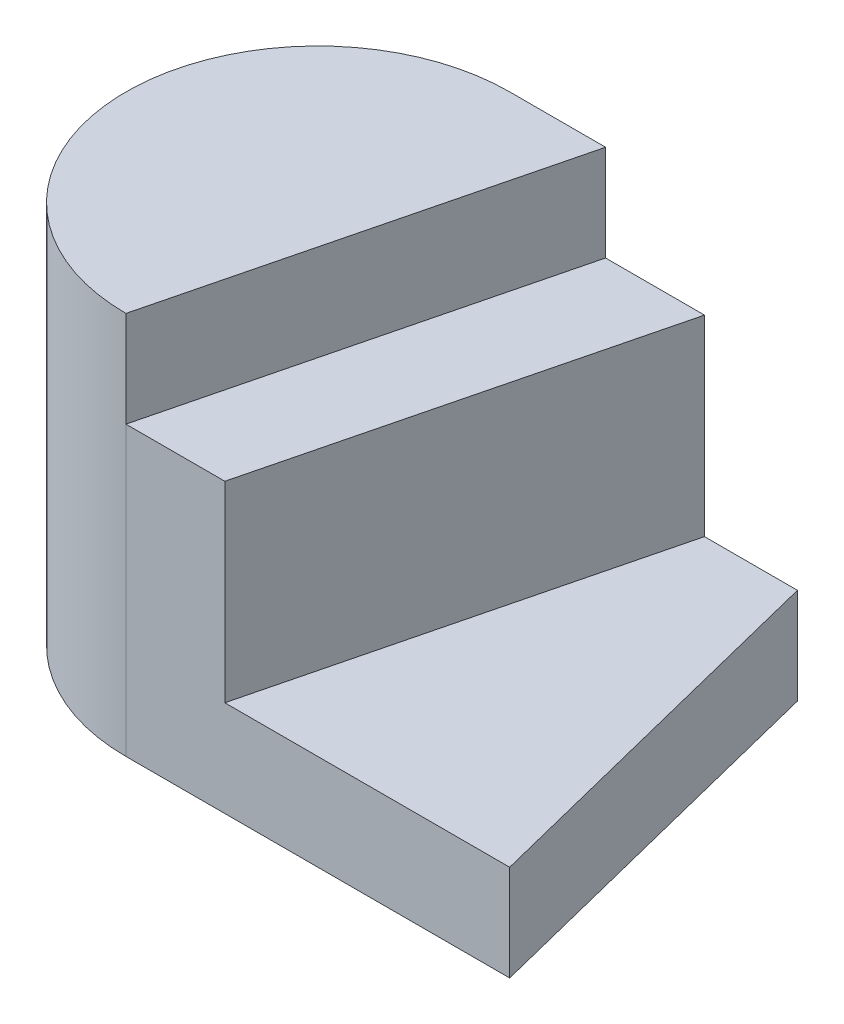
ISO-10303-21;
HEADER;
FILE_DESCRIPTION(('STEP AP214'),'2;1');
FILE_NAME('part.step','',(''),(''),'','','');
FILE_SCHEMA(('AUTOMOTIVE_DESIGN { 1 0 10303 214 1 1 1 1 }'));
ENDSEC;
DATA;
#1=APPLICATION_CONTEXT('core data for automotive mechanical design processes');
#2=APPLICATION_PROTOCOL_DEFINITION('international standard','automotive_design',2000,#1);
#3=PRODUCT_CONTEXT('',#1,'mechanical');
#4=PRODUCT('Part','Part','',(#3));
#5=PRODUCT_RELATED_PRODUCT_CATEGORY('part','',(#4));
#6=PRODUCT_DEFINITION_FORMATION('','',#4);
#7=PRODUCT_DEFINITION_CONTEXT('part definition',#1,'design');
#8=PRODUCT_DEFINITION('design','',#6,#7);
#9=PRODUCT_DEFINITION_SHAPE('','',#8);
#10=(LENGTH_UNIT() NAMED_UNIT(*) SI_UNIT(.MILLI.,.METRE.));
#11=(NAMED_UNIT(*) PLANE_ANGLE_UNIT() SI_UNIT($,.RADIAN.));
#12=(NAMED_UNIT(*) SI_UNIT($,.STERADIAN.) SOLID_ANGLE_UNIT());
#13=UNCERTAINTY_MEASURE_WITH_UNIT(LENGTH_MEASURE(1.E-05),#10,'distance_accuracy_value','');
#14=(GEOMETRIC_REPRESENTATION_CONTEXT(3) GLOBAL_UNCERTAINTY_ASSIGNED_CONTEXT((#13)) GLOBAL_UNIT_ASSIGNED_CONTEXT((#10,
#11,#12)) REPRESENTATION_CONTEXT('',''));
#15=CARTESIAN_POINT('',(0.,0.,0.));
#16=DIRECTION('',(0.,0.,1.));
#17=DIRECTION('',(1.,0.,0.));
#18=AXIS2_PLACEMENT_3D('',#15,#16,#17);
#19=CARTESIAN_POINT('',(0.,0.,0.));
#20=DIRECTION('',(0.,1.,0.));
#21=DIRECTION('',(0.,0.,1.));
#22=AXIS2_PLACEMENT_3D('',#19,#20,#21);
#23=PLANE('',#22);
#24=DIRECTION('',(-0.242535625036333,0.,0.970142500145332));
#25=VECTOR('',#24,1.);
#26=CARTESIAN_POINT('',(14.4073073543945,0.,3.60182683859862));
#27=LINE('',#26,#25);
#28=CARTESIAN_POINT('',(20.3077640640442,0.,-20.));
#29=VERTEX_POINT('',#28);
#30=CARTESIAN_POINT('',(10.3077640640442,0.,20.));
#31=VERTEX_POINT('',#30);
#32=EDGE_CURVE('E55',#29,#31,#27,.T.);
#33=ORIENTED_EDGE('',*,*,#32,.T.);
#34=DIRECTION('',(1.,0.,0.));
#35=VECTOR('',#34,1.);
#36=CARTESIAN_POINT('',(0.,0.,20.));
#37=LINE('',#36,#35);
#38=CARTESIAN_POINT('',(40.,0.,20.));
#39=VERTEX_POINT('',#38);
#40=EDGE_CURVE('E136',#31,#39,#37,.T.);
#41=ORIENTED_EDGE('',*,*,#40,.T.);
#42=DIRECTION('',(-0.242535625036333,0.,-0.970142500145332));
#43=VECTOR('',#42,1.);
#44=CARTESIAN_POINT('',(40.,0.,20.));
#45=LINE('',#44,#43);
#46=CARTESIAN_POINT('',(30.,0.,-20.));
#47=VERTEX_POINT('',#46);
#48=EDGE_CURVE('E150',#39,#47,#45,.T.);
#49=ORIENTED_EDGE('',*,*,#48,.T.);
#50=DIRECTION('',(-1.,0.,0.));
#51=VECTOR('',#50,1.);
#52=CARTESIAN_POINT('',(30.,0.,-20.));
#53=LINE('',#52,#51);
#54=EDGE_CURVE('E50',#47,#29,#53,.T.);
#55=ORIENTED_EDGE('',*,*,#54,.T.);
#56=EDGE_LOOP('',(#33,#41,#49,#55));
#57=FACE_BOUND('',#56,.T.);
#58=ADVANCED_FACE('F33',(#57),#23,.T.);
#59=CARTESIAN_POINT('',(0.,-10.,0.));
#60=DIRECTION('',(0.,1.,0.));
#61=DIRECTION('',(0.,0.,1.));
#62=AXIS2_PLACEMENT_3D('',#59,#60,#61);
#63=CYLINDRICAL_SURFACE('',#62,20.);
#64=DIRECTION('',(0.,1.,0.));
#65=VECTOR('',#64,1.);
#66=CARTESIAN_POINT('',(0.,-10.,20.));
#67=LINE('',#66,#65);
#68=CARTESIAN_POINT('',(0.,-10.,20.));
#69=VERTEX_POINT('',#68);
#70=CARTESIAN_POINT('',(0.,20.,20.));
#71=VERTEX_POINT('',#70);
#72=EDGE_CURVE('E37',#69,#71,#67,.T.);
#73=ORIENTED_EDGE('',*,*,#72,.T.);
#74=DIRECTION('',(0.,-1.,0.));
#75=VECTOR('',#74,1.);
#76=CARTESIAN_POINT('',(0.,30.,20.));
#77=LINE('',#76,#75);
#78=CARTESIAN_POINT('',(0.,30.,20.));
#79=VERTEX_POINT('',#78);
#80=EDGE_CURVE('E132',#79,#71,#77,.T.);
#81=ORIENTED_EDGE('',*,*,#80,.F.);
#82=CARTESIAN_POINT('',(0.,30.,0.));
#83=DIRECTION('',(0.,1.,0.));
#84=DIRECTION('',(0.,0.,1.));
#85=AXIS2_PLACEMENT_3D('',#82,#83,#84);
#86=CIRCLE('',#85,20.);
#87=CARTESIAN_POINT('',(0.,30.,-20.));
#88=VERTEX_POINT('',#87);
#89=EDGE_CURVE('E130',#88,#79,#86,.T.);
#90=ORIENTED_EDGE('',*,*,#89,.F.);
#91=DIRECTION('',(0.,1.,0.));
#92=VECTOR('',#91,1.);
#93=CARTESIAN_POINT('',(0.,-10.,-20.));
#94=LINE('',#93,#92);
#95=CARTESIAN_POINT('',(0.,-10.,-20.));
#96=VERTEX_POINT('',#95);
#97=EDGE_CURVE('E11',#96,#88,#94,.T.);
#98=ORIENTED_EDGE('',*,*,#97,.F.);
#99=CARTESIAN_POINT('',(0.,-10.,0.));
#100=DIRECTION('',(0.,1.,0.));
#101=DIRECTION('',(0.,0.,1.));
#102=AXIS2_PLACEMENT_3D('',#99,#100,#101);
#103=CIRCLE('',#102,20.);
#104=EDGE_CURVE('E137',#96,#69,#103,.T.);
#105=ORIENTED_EDGE('',*,*,#104,.T.);
#106=EDGE_LOOP('',(#73,#81,#90,#98,#105));
#107=FACE_BOUND('',#106,.T.);
#108=ADVANCED_FACE('F35',(#107),#63,.T.);
#109=CARTESIAN_POINT('',(30.,-10.,-20.));
#110=DIRECTION('',(0.,0.,-1.));
#111=DIRECTION('',(-1.,0.,0.));
#112=AXIS2_PLACEMENT_3D('',#109,#110,#111);
#113=PLANE('',#112);
#114=ORIENTED_EDGE('',*,*,#54,.F.);
#115=DIRECTION('',(0.,1.,0.));
#116=VECTOR('',#115,1.);
#117=CARTESIAN_POINT('',(30.,-10.,-20.));
#118=LINE('',#117,#116);
#119=CARTESIAN_POINT('',(30.,-10.,-20.));
#120=VERTEX_POINT('',#119);
#121=EDGE_CURVE('E42',#120,#47,#118,.T.);
#122=ORIENTED_EDGE('',*,*,#121,.F.);
#123=DIRECTION('',(-1.,0.,0.));
#124=VECTOR('',#123,1.);
#125=CARTESIAN_POINT('',(30.,-10.,-20.));
#126=LINE('',#125,#124);
#127=EDGE_CURVE('E146',#120,#96,#126,.T.);
#128=ORIENTED_EDGE('',*,*,#127,.T.);
#129=ORIENTED_EDGE('',*,*,#97,.T.);
#130=DIRECTION('',(-1.,0.,0.));
#131=VECTOR('',#130,1.);
#132=CARTESIAN_POINT('',(0.,30.,-20.));
#133=LINE('',#132,#131);
#134=CARTESIAN_POINT('',(10.,30.,-20.));
#135=VERTEX_POINT('',#134);
#136=EDGE_CURVE('E127',#135,#88,#133,.T.);
#137=ORIENTED_EDGE('',*,*,#136,.F.);
#138=DIRECTION('',(0.,-1.,0.));
#139=VECTOR('',#138,1.);
#140=CARTESIAN_POINT('',(10.,30.,-20.));
#141=LINE('',#140,#139);
#142=CARTESIAN_POINT('',(10.,20.,-20.));
#143=VERTEX_POINT('',#142);
#144=EDGE_CURVE('E110',#135,#143,#141,.T.);
#145=ORIENTED_EDGE('',*,*,#144,.T.);
#146=DIRECTION('',(-1.,0.,0.));
#147=VECTOR('',#146,1.);
#148=CARTESIAN_POINT('',(0.,20.,-20.));
#149=LINE('',#148,#147);
#150=CARTESIAN_POINT('',(20.3077640640442,20.,-20.));
#151=VERTEX_POINT('',#150);
#152=EDGE_CURVE('E107',#151,#143,#149,.T.);
#153=ORIENTED_EDGE('',*,*,#152,.F.);
#154=DIRECTION('',(0.,-1.,0.));
#155=VECTOR('',#154,1.);
#156=CARTESIAN_POINT('',(20.3077640640442,20.,-20.));
#157=LINE('',#156,#155);
#158=EDGE_CURVE('E95',#151,#29,#157,.T.);
#159=ORIENTED_EDGE('',*,*,#158,.T.);
#160=EDGE_LOOP('',(#114,#122,#128,#129,#137,#145,#153,#159));
#161=FACE_BOUND('',#160,.T.);
#162=ADVANCED_FACE('F108',(#161),#113,.T.);
#163=CARTESIAN_POINT('',(40.,-10.,20.));
#164=DIRECTION('',(0.970142500145332,0.,-0.242535625036333));
#165=DIRECTION('',(-0.242535625036333,0.,-0.970142500145332));
#166=AXIS2_PLACEMENT_3D('',#163,#164,#165);
#167=PLANE('',#166);
#168=ORIENTED_EDGE('',*,*,#48,.F.);
#169=DIRECTION('',(0.,1.,0.));
#170=VECTOR('',#169,1.);
#171=CARTESIAN_POINT('',(40.,-10.,20.));
#172=LINE('',#171,#170);
#173=CARTESIAN_POINT('',(40.,-10.,20.));
#174=VERTEX_POINT('',#173);
#175=EDGE_CURVE('E153',#174,#39,#172,.T.);
#176=ORIENTED_EDGE('',*,*,#175,.F.);
#177=DIRECTION('',(-0.242535625036333,0.,-0.970142500145332));
#178=VECTOR('',#177,1.);
#179=CARTESIAN_POINT('',(40.,-10.,20.));
#180=LINE('',#179,#178);
#181=EDGE_CURVE('E143',#174,#120,#180,.T.);
#182=ORIENTED_EDGE('',*,*,#181,.T.);
#183=ORIENTED_EDGE('',*,*,#121,.T.);
#184=EDGE_LOOP('',(#168,#176,#182,#183));
#185=FACE_BOUND('',#184,.T.);
#186=ADVANCED_FACE('F169',(#185),#167,.T.);
#187=CARTESIAN_POINT('',(0.,-10.,20.));
#188=DIRECTION('',(0.,0.,1.));
#189=DIRECTION('',(1.,0.,0.));
#190=AXIS2_PLACEMENT_3D('',#187,#188,#189);
#191=PLANE('',#190);
#192=ORIENTED_EDGE('',*,*,#40,.F.);
#193=DIRECTION('',(0.,-1.,0.));
#194=VECTOR('',#193,1.);
#195=CARTESIAN_POINT('',(10.3077640640442,20.,20.));
#196=LINE('',#195,#194);
#197=CARTESIAN_POINT('',(10.3077640640442,20.,20.));
#198=VERTEX_POINT('',#197);
#199=EDGE_CURVE('E103',#198,#31,#196,.T.);
#200=ORIENTED_EDGE('',*,*,#199,.F.);
#201=DIRECTION('',(1.,0.,0.));
#202=VECTOR('',#201,1.);
#203=CARTESIAN_POINT('',(0.,20.,20.));
#204=LINE('',#203,#202);
#205=EDGE_CURVE('E117',#71,#198,#204,.T.);
#206=ORIENTED_EDGE('',*,*,#205,.F.);
#207=ORIENTED_EDGE('',*,*,#72,.F.);
#208=DIRECTION('',(1.,0.,0.));
#209=VECTOR('',#208,1.);
#210=CARTESIAN_POINT('',(0.,-10.,20.));
#211=LINE('',#210,#209);
#212=EDGE_CURVE('E140',#69,#174,#211,.T.);
#213=ORIENTED_EDGE('',*,*,#212,.T.);
#214=ORIENTED_EDGE('',*,*,#175,.T.);
#215=EDGE_LOOP('',(#192,#200,#206,#207,#213,#214));
#216=FACE_BOUND('',#215,.T.);
#217=ADVANCED_FACE('F165',(#216),#191,.T.);
#218=CARTESIAN_POINT('',(0.,-10.,0.));
#219=DIRECTION('',(0.,1.,0.));
#220=DIRECTION('',(0.,0.,1.));
#221=AXIS2_PLACEMENT_3D('',#218,#219,#220);
#222=PLANE('',#221);
#223=ORIENTED_EDGE('',*,*,#104,.F.);
#224=ORIENTED_EDGE('',*,*,#127,.F.);
#225=ORIENTED_EDGE('',*,*,#181,.F.);
#226=ORIENTED_EDGE('',*,*,#212,.F.);
#227=EDGE_LOOP('',(#223,#224,#225,#226));
#228=FACE_BOUND('',#227,.T.);
#229=ADVANCED_FACE('F171',(#228),#222,.F.);
#230=CARTESIAN_POINT('',(4.70588235294118,30.,1.17647058823529));
#231=DIRECTION('',(0.970142500145332,0.,0.242535625036333));
#232=DIRECTION('',(0.242535625036333,0.,-0.970142500145332));
#233=AXIS2_PLACEMENT_3D('',#230,#231,#232);
#234=PLANE('',#233);
#235=DIRECTION('',(-0.242535625036333,0.,0.970142500145332));
#236=VECTOR('',#235,1.);
#237=CARTESIAN_POINT('',(4.70588235294118,20.,1.17647058823529));
#238=LINE('',#237,#236);
#239=EDGE_CURVE('E113',#143,#71,#238,.T.);
#240=ORIENTED_EDGE('',*,*,#239,.F.);
#241=ORIENTED_EDGE('',*,*,#144,.F.);
#242=DIRECTION('',(-0.242535625036333,0.,0.970142500145332));
#243=VECTOR('',#242,1.);
#244=CARTESIAN_POINT('',(4.70588235294118,30.,1.17647058823529));
#245=LINE('',#244,#243);
#246=EDGE_CURVE('E102',#135,#79,#245,.T.);
#247=ORIENTED_EDGE('',*,*,#246,.T.);
#248=ORIENTED_EDGE('',*,*,#80,.T.);
#249=EDGE_LOOP('',(#240,#241,#247,#248));
#250=FACE_BOUND('',#249,.T.);
#251=ADVANCED_FACE('F163',(#250),#234,.T.);
#252=CARTESIAN_POINT('',(0.,30.,0.));
#253=DIRECTION('',(0.,1.,0.));
#254=DIRECTION('',(0.,0.,1.));
#255=AXIS2_PLACEMENT_3D('',#252,#253,#254);
#256=PLANE('',#255);
#257=ORIENTED_EDGE('',*,*,#246,.F.);
#258=ORIENTED_EDGE('',*,*,#136,.T.);
#259=ORIENTED_EDGE('',*,*,#89,.T.);
#260=EDGE_LOOP('',(#257,#258,#259));
#261=FACE_BOUND('',#260,.T.);
#262=ADVANCED_FACE('F178',(#261),#256,.T.);
#263=CARTESIAN_POINT('',(14.4073073543945,20.,3.60182683859862));
#264=DIRECTION('',(0.970142500145332,0.,0.242535625036333));
#265=DIRECTION('',(0.242535625036333,0.,-0.970142500145332));
#266=AXIS2_PLACEMENT_3D('',#263,#264,#265);
#267=PLANE('',#266);
#268=ORIENTED_EDGE('',*,*,#32,.F.);
#269=ORIENTED_EDGE('',*,*,#158,.F.);
#270=DIRECTION('',(-0.242535625036333,0.,0.970142500145332));
#271=VECTOR('',#270,1.);
#272=CARTESIAN_POINT('',(14.4073073543945,20.,3.60182683859862));
#273=LINE('',#272,#271);
#274=EDGE_CURVE('E100',#151,#198,#273,.T.);
#275=ORIENTED_EDGE('',*,*,#274,.T.);
#276=ORIENTED_EDGE('',*,*,#199,.T.);
#277=EDGE_LOOP('',(#268,#269,#275,#276));
#278=FACE_BOUND('',#277,.T.);
#279=ADVANCED_FACE('F97',(#278),#267,.T.);
#280=CARTESIAN_POINT('',(0.,20.,0.));
#281=DIRECTION('',(0.,1.,0.));
#282=DIRECTION('',(0.,0.,1.));
#283=AXIS2_PLACEMENT_3D('',#280,#281,#282);
#284=PLANE('',#283);
#285=ORIENTED_EDGE('',*,*,#274,.F.);
#286=ORIENTED_EDGE('',*,*,#152,.T.);
#287=ORIENTED_EDGE('',*,*,#239,.T.);
#288=ORIENTED_EDGE('',*,*,#205,.T.);
#289=EDGE_LOOP('',(#285,#286,#287,#288));
#290=FACE_BOUND('',#289,.T.);
#291=ADVANCED_FACE('F115',(#290),#284,.T.);
#292=CLOSED_SHELL('',(#58,#108,#162,#186,#217,#229,#251,#262,#279,#291));
#293=MANIFOLD_SOLID_BREP('B2',#292);
#294=ADVANCED_BREP_SHAPE_REPRESENTATION('',(#18,#293),#14);
#295=SHAPE_DEFINITION_REPRESENTATION(#9,#294);
ENDSEC;
END-ISO-10303-21;
